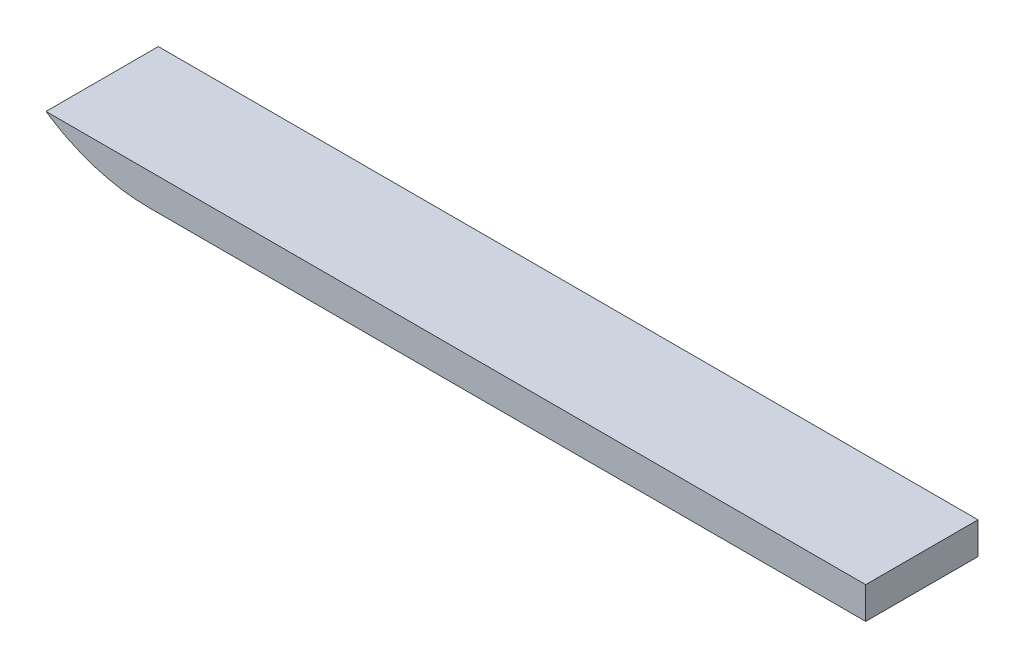
ISO-10303-21;
HEADER;
FILE_DESCRIPTION(('STEP AP214'),'2;1');
FILE_NAME('part.step','',(''),(''),'','','');
FILE_SCHEMA(('AUTOMOTIVE_DESIGN { 1 0 10303 214 1 1 1 1 }'));
ENDSEC;
DATA;
#1=APPLICATION_CONTEXT('core data for automotive mechanical design processes');
#2=APPLICATION_PROTOCOL_DEFINITION('international standard','automotive_design',2000,#1);
#3=PRODUCT_CONTEXT('',#1,'mechanical');
#4=PRODUCT('Part','Part','',(#3));
#5=PRODUCT_RELATED_PRODUCT_CATEGORY('part','',(#4));
#6=PRODUCT_DEFINITION_FORMATION('','',#4);
#7=PRODUCT_DEFINITION_CONTEXT('part definition',#1,'design');
#8=PRODUCT_DEFINITION('design','',#6,#7);
#9=PRODUCT_DEFINITION_SHAPE('','',#8);
#10=(LENGTH_UNIT() NAMED_UNIT(*) SI_UNIT(.MILLI.,.METRE.));
#11=(NAMED_UNIT(*) PLANE_ANGLE_UNIT() SI_UNIT($,.RADIAN.));
#12=(NAMED_UNIT(*) SI_UNIT($,.STERADIAN.) SOLID_ANGLE_UNIT());
#13=UNCERTAINTY_MEASURE_WITH_UNIT(LENGTH_MEASURE(1.E-05),#10,'distance_accuracy_value','');
#14=(GEOMETRIC_REPRESENTATION_CONTEXT(3) GLOBAL_UNCERTAINTY_ASSIGNED_CONTEXT((#13)) GLOBAL_UNIT_ASSIGNED_CONTEXT((#10,
#11,#12)) REPRESENTATION_CONTEXT('',''));
#15=CARTESIAN_POINT('',(0.,0.,0.));
#16=DIRECTION('',(0.,0.,1.));
#17=DIRECTION('',(1.,0.,0.));
#18=AXIS2_PLACEMENT_3D('',#15,#16,#17);
#19=CARTESIAN_POINT('',(-19.8099999991093,4.77999999975426,0.));
#20=DIRECTION('',(0.,-1.,0.));
#21=DIRECTION('',(-1.,0.,0.));
#22=AXIS2_PLACEMENT_3D('',#19,#20,#21);
#23=PLANE('',#22);
#24=DIRECTION('',(0.,0.,-1.));
#25=VECTOR('',#24,1.);
#26=CARTESIAN_POINT('',(-21.5099999991092,4.77999999975427,0.));
#27=LINE('',#26,#25);
#28=CARTESIAN_POINT('',(-21.5099999991092,4.77999999975427,0.810000000000019));
#29=VERTEX_POINT('',#28);
#30=CARTESIAN_POINT('',(-21.5099999991092,4.77999999975427,0.440000000000017));
#31=VERTEX_POINT('',#30);
#32=EDGE_CURVE('E11',#29,#31,#27,.T.);
#33=ORIENTED_EDGE('',*,*,#32,.F.);
#34=DIRECTION('',(-1.,0.,0.));
#35=VECTOR('',#34,1.);
#36=CARTESIAN_POINT('',(-19.8099999991093,4.77999999975426,0.810000000000019));
#37=LINE('',#36,#35);
#38=CARTESIAN_POINT('',(-18.8099999991093,4.77999999975426,0.810000000000019));
#39=VERTEX_POINT('',#38);
#40=EDGE_CURVE('E24',#39,#29,#37,.T.);
#41=ORIENTED_EDGE('',*,*,#40,.F.);
#42=DIRECTION('',(0.,0.,1.));
#43=VECTOR('',#42,1.);
#44=CARTESIAN_POINT('',(-18.8099999991093,4.77999999975426,0.));
#45=LINE('',#44,#43);
#46=CARTESIAN_POINT('',(-18.8099999991093,4.77999999975426,0.440000000000018));
#47=VERTEX_POINT('',#46);
#48=EDGE_CURVE('E69',#47,#39,#45,.T.);
#49=ORIENTED_EDGE('',*,*,#48,.F.);
#50=DIRECTION('',(1.,0.,0.));
#51=VECTOR('',#50,1.);
#52=CARTESIAN_POINT('',(-19.8099999991093,4.77999999975426,0.440000000000017));
#53=LINE('',#52,#51);
#54=EDGE_CURVE('E85',#31,#47,#53,.T.);
#55=ORIENTED_EDGE('',*,*,#54,.F.);
#56=EDGE_LOOP('',(#33,#41,#49,#55));
#57=FACE_BOUND('',#56,.T.);
#58=ADVANCED_FACE('F17',(#57),#23,.F.);
#59=CARTESIAN_POINT('',(-21.5099999991092,4.67499999975427,0.440000000000017));
#60=DIRECTION('',(0.,0.,1.));
#61=DIRECTION('',(1.,0.,0.));
#62=AXIS2_PLACEMENT_3D('',#59,#60,#61);
#63=PLANE('',#62);
#64=CARTESIAN_POINT('',(-21.1709203624455,5.27499999975427,0.440000000000017));
#65=DIRECTION('',(0.,0.,1.));
#66=DIRECTION('',(-1.,0.,0.));
#67=AXIS2_PLACEMENT_3D('',#64,#65,#66);
#68=CIRCLE('',#67,0.6);
#69=CARTESIAN_POINT('',(-21.1709203624455,4.67499999975427,0.440000000000017));
#70=VERTEX_POINT('',#69);
#71=EDGE_CURVE('E83',#31,#70,#68,.T.);
#72=ORIENTED_EDGE('',*,*,#71,.F.);
#73=ORIENTED_EDGE('',*,*,#54,.T.);
#74=DIRECTION('',(0.,1.,0.));
#75=VECTOR('',#74,1.);
#76=CARTESIAN_POINT('',(-18.8099999991093,4.67499999975427,0.440000000000019));
#77=LINE('',#76,#75);
#78=CARTESIAN_POINT('',(-18.8099999991093,4.67499999975427,0.440000000000018));
#79=VERTEX_POINT('',#78);
#80=EDGE_CURVE('E81',#79,#47,#77,.T.);
#81=ORIENTED_EDGE('',*,*,#80,.F.);
#82=DIRECTION('',(1.,0.,0.));
#83=VECTOR('',#82,1.);
#84=CARTESIAN_POINT('',(-21.5099999991092,4.67499999975427,0.440000000000017));
#85=LINE('',#84,#83);
#86=EDGE_CURVE('E74',#70,#79,#85,.T.);
#87=ORIENTED_EDGE('',*,*,#86,.F.);
#88=EDGE_LOOP('',(#72,#73,#81,#87));
#89=FACE_BOUND('',#88,.T.);
#90=ADVANCED_FACE('F91',(#89),#63,.F.);
#91=CARTESIAN_POINT('',(-21.1709203624455,5.27499999975427,1.515));
#92=DIRECTION('',(0.,0.,-1.));
#93=DIRECTION('',(-1.,0.,0.));
#94=AXIS2_PLACEMENT_3D('',#91,#92,#93);
#95=CYLINDRICAL_SURFACE('',#94,0.6);
#96=ORIENTED_EDGE('',*,*,#32,.T.);
#97=ORIENTED_EDGE('',*,*,#71,.T.);
#98=DIRECTION('',(0.,0.,1.));
#99=VECTOR('',#98,1.);
#100=CARTESIAN_POINT('',(-21.1709203624455,4.67499999975427,1.515));
#101=LINE('',#100,#99);
#102=CARTESIAN_POINT('',(-21.1709203624455,4.67499999975426,0.810000000000019));
#103=VERTEX_POINT('',#102);
#104=EDGE_CURVE('E78',#70,#103,#101,.T.);
#105=ORIENTED_EDGE('',*,*,#104,.T.);
#106=CARTESIAN_POINT('',(-21.1709203624455,5.27499999975427,0.810000000000019));
#107=DIRECTION('',(0.,0.,-1.));
#108=DIRECTION('',(-1.,0.,0.));
#109=AXIS2_PLACEMENT_3D('',#106,#107,#108);
#110=CIRCLE('',#109,0.6);
#111=EDGE_CURVE('E58',#103,#29,#110,.T.);
#112=ORIENTED_EDGE('',*,*,#111,.T.);
#113=EDGE_LOOP('',(#96,#97,#105,#112));
#114=FACE_BOUND('',#113,.T.);
#115=ADVANCED_FACE('F88',(#114),#95,.T.);
#116=CARTESIAN_POINT('',(-21.5099999991092,4.67499999975427,0.810000000000019));
#117=DIRECTION('',(0.,0.,-1.));
#118=DIRECTION('',(0.,-1.,0.));
#119=AXIS2_PLACEMENT_3D('',#116,#117,#118);
#120=PLANE('',#119);
#121=ORIENTED_EDGE('',*,*,#111,.F.);
#122=DIRECTION('',(-1.,0.,0.));
#123=VECTOR('',#122,1.);
#124=CARTESIAN_POINT('',(-21.5099999991092,4.67499999975426,0.810000000000019));
#125=LINE('',#124,#123);
#126=CARTESIAN_POINT('',(-18.8099999991093,4.67499999975426,0.810000000000019));
#127=VERTEX_POINT('',#126);
#128=EDGE_CURVE('E54',#127,#103,#125,.T.);
#129=ORIENTED_EDGE('',*,*,#128,.F.);
#130=DIRECTION('',(0.,-1.,0.));
#131=VECTOR('',#130,1.);
#132=CARTESIAN_POINT('',(-18.8099999991093,4.67499999975427,0.81000000000002));
#133=LINE('',#132,#131);
#134=EDGE_CURVE('E57',#39,#127,#133,.T.);
#135=ORIENTED_EDGE('',*,*,#134,.F.);
#136=ORIENTED_EDGE('',*,*,#40,.T.);
#137=EDGE_LOOP('',(#121,#129,#135,#136));
#138=FACE_BOUND('',#137,.T.);
#139=ADVANCED_FACE('F56',(#138),#120,.F.);
#140=CARTESIAN_POINT('',(-18.8099999991093,4.67499999975426,0.440000000000017));
#141=DIRECTION('',(-1.,0.,0.));
#142=DIRECTION('',(0.,0.,1.));
#143=AXIS2_PLACEMENT_3D('',#140,#141,#142);
#144=PLANE('',#143);
#145=ORIENTED_EDGE('',*,*,#134,.T.);
#146=DIRECTION('',(0.,0.,1.));
#147=VECTOR('',#146,1.);
#148=CARTESIAN_POINT('',(-18.8099999991093,4.67499999975426,0.440000000000017));
#149=LINE('',#148,#147);
#150=EDGE_CURVE('E68',#79,#127,#149,.T.);
#151=ORIENTED_EDGE('',*,*,#150,.F.);
#152=ORIENTED_EDGE('',*,*,#80,.T.);
#153=ORIENTED_EDGE('',*,*,#48,.T.);
#154=EDGE_LOOP('',(#145,#151,#152,#153));
#155=FACE_BOUND('',#154,.T.);
#156=ADVANCED_FACE('F66',(#155),#144,.F.);
#157=CARTESIAN_POINT('',(-19.8099999991093,4.67499999975426,0.));
#158=DIRECTION('',(0.,-1.,0.));
#159=DIRECTION('',(-1.,0.,0.));
#160=AXIS2_PLACEMENT_3D('',#157,#158,#159);
#161=PLANE('',#160);
#162=ORIENTED_EDGE('',*,*,#150,.T.);
#163=ORIENTED_EDGE('',*,*,#128,.T.);
#164=ORIENTED_EDGE('',*,*,#104,.F.);
#165=ORIENTED_EDGE('',*,*,#86,.T.);
#166=EDGE_LOOP('',(#162,#163,#164,#165));
#167=FACE_BOUND('',#166,.T.);
#168=ADVANCED_FACE('F72',(#167),#161,.T.);
#169=CLOSED_SHELL('',(#58,#90,#115,#139,#156,#168));
#170=MANIFOLD_SOLID_BREP('B1',#169);
#171=ADVANCED_BREP_SHAPE_REPRESENTATION('',(#18,#170),#14);
#172=SHAPE_DEFINITION_REPRESENTATION(#9,#171);
ENDSEC;
END-ISO-10303-21;
